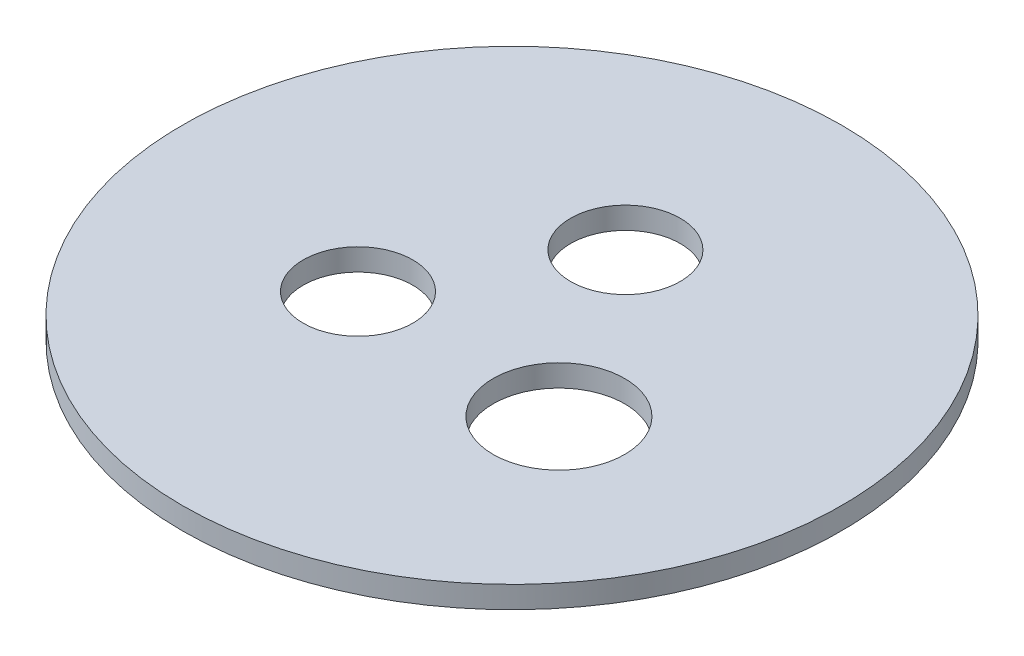
ISO-10303-21;
HEADER;
FILE_DESCRIPTION(('STEP AP214'),'2;1');
FILE_NAME('part.step','',(''),(''),'','','');
FILE_SCHEMA(('AUTOMOTIVE_DESIGN { 1 0 10303 214 1 1 1 1 }'));
ENDSEC;
DATA;
#1=APPLICATION_CONTEXT('core data for automotive mechanical design processes');
#2=APPLICATION_PROTOCOL_DEFINITION('international standard','automotive_design',2000,#1);
#3=PRODUCT_CONTEXT('',#1,'mechanical');
#4=PRODUCT('Part','Part','',(#3));
#5=PRODUCT_RELATED_PRODUCT_CATEGORY('part','',(#4));
#6=PRODUCT_DEFINITION_FORMATION('','',#4);
#7=PRODUCT_DEFINITION_CONTEXT('part definition',#1,'design');
#8=PRODUCT_DEFINITION('design','',#6,#7);
#9=PRODUCT_DEFINITION_SHAPE('','',#8);
#10=(LENGTH_UNIT() NAMED_UNIT(*) SI_UNIT(.MILLI.,.METRE.));
#11=(NAMED_UNIT(*) PLANE_ANGLE_UNIT() SI_UNIT($,.RADIAN.));
#12=(NAMED_UNIT(*) SI_UNIT($,.STERADIAN.) SOLID_ANGLE_UNIT());
#13=UNCERTAINTY_MEASURE_WITH_UNIT(LENGTH_MEASURE(1.E-05),#10,'distance_accuracy_value','');
#14=(GEOMETRIC_REPRESENTATION_CONTEXT(3) GLOBAL_UNCERTAINTY_ASSIGNED_CONTEXT((#13)) GLOBAL_UNIT_ASSIGNED_CONTEXT((#10,
#11,#12)) REPRESENTATION_CONTEXT('',''));
#15=CARTESIAN_POINT('',(0.,0.,0.));
#16=DIRECTION('',(0.,0.,1.));
#17=DIRECTION('',(1.,0.,0.));
#18=AXIS2_PLACEMENT_3D('',#15,#16,#17);
#19=CARTESIAN_POINT('',(0.,2.,0.));
#20=DIRECTION('',(0.,-1.,0.));
#21=DIRECTION('',(0.,0.,-1.));
#22=AXIS2_PLACEMENT_3D('',#19,#20,#21);
#23=CYLINDRICAL_SURFACE('',#22,30.05);
#24=CARTESIAN_POINT('',(0.,2.,0.));
#25=DIRECTION('',(0.,1.,0.));
#26=DIRECTION('',(0.,0.,1.));
#27=AXIS2_PLACEMENT_3D('',#24,#25,#26);
#28=CIRCLE('',#27,30.05);
#29=CARTESIAN_POINT('',(0.,2.,30.05));
#30=VERTEX_POINT('',#29);
#31=EDGE_CURVE('E10',#30,#30,#28,.T.);
#32=ORIENTED_EDGE('',*,*,#31,.F.);
#33=EDGE_LOOP('',(#32));
#34=FACE_BOUND('',#33,.T.);
#35=CARTESIAN_POINT('',(0.,0.,0.));
#36=DIRECTION('',(0.,1.,0.));
#37=DIRECTION('',(0.,0.,1.));
#38=AXIS2_PLACEMENT_3D('',#35,#36,#37);
#39=CIRCLE('',#38,30.05);
#40=CARTESIAN_POINT('',(0.,0.,30.05));
#41=VERTEX_POINT('',#40);
#42=EDGE_CURVE('E34',#41,#41,#39,.T.);
#43=ORIENTED_EDGE('',*,*,#42,.T.);
#44=EDGE_LOOP('',(#43));
#45=FACE_BOUND('',#44,.T.);
#46=ADVANCED_FACE('F31',(#34,#45),#23,.T.);
#47=CARTESIAN_POINT('',(0.,2.,0.));
#48=DIRECTION('',(0.,1.,0.));
#49=DIRECTION('',(0.,0.,1.));
#50=AXIS2_PLACEMENT_3D('',#47,#48,#49);
#51=PLANE('',#50);
#52=CARTESIAN_POINT('',(0.,2.,-10.3418538901785));
#53=DIRECTION('',(0.,1.,0.));
#54=DIRECTION('',(0.,0.,1.));
#55=AXIS2_PLACEMENT_3D('',#52,#53,#54);
#56=CIRCLE('',#55,5.);
#57=CARTESIAN_POINT('',(0.,2.,-5.34185389017855));
#58=VERTEX_POINT('',#57);
#59=EDGE_CURVE('E55',#58,#58,#56,.T.);
#60=ORIENTED_EDGE('',*,*,#59,.F.);
#61=EDGE_LOOP('',(#60));
#62=FACE_BOUND('',#61,.T.);
#63=CARTESIAN_POINT('',(-8.9026543915802,2.,5.13994990948109));
#64=DIRECTION('',(0.,1.,0.));
#65=DIRECTION('',(0.,0.,1.));
#66=AXIS2_PLACEMENT_3D('',#63,#64,#65);
#67=CIRCLE('',#66,5.00000000000001);
#68=CARTESIAN_POINT('',(-8.9026543915802,2.,10.1399499094811));
#69=VERTEX_POINT('',#68);
#70=EDGE_CURVE('E49',#69,#69,#67,.T.);
#71=ORIENTED_EDGE('',*,*,#70,.F.);
#72=EDGE_LOOP('',(#71));
#73=FACE_BOUND('',#72,.T.);
#74=CARTESIAN_POINT('',(10.1251210998582,2.,5.84574139258078));
#75=DIRECTION('',(0.,1.,0.));
#76=DIRECTION('',(0.,0.,1.));
#77=AXIS2_PLACEMENT_3D('',#74,#75,#76);
#78=CIRCLE('',#77,6.);
#79=CARTESIAN_POINT('',(10.1251210998582,2.,11.8457413925808));
#80=VERTEX_POINT('',#79);
#81=EDGE_CURVE('E43',#80,#80,#78,.T.);
#82=ORIENTED_EDGE('',*,*,#81,.F.);
#83=EDGE_LOOP('',(#82));
#84=FACE_BOUND('',#83,.T.);
#85=ORIENTED_EDGE('',*,*,#31,.T.);
#86=EDGE_LOOP('',(#85));
#87=FACE_BOUND('',#86,.T.);
#88=ADVANCED_FACE('F71',(#62,#73,#84,#87),#51,.T.);
#89=CARTESIAN_POINT('',(0.,0.,0.));
#90=DIRECTION('',(0.,1.,0.));
#91=DIRECTION('',(0.,0.,1.));
#92=AXIS2_PLACEMENT_3D('',#89,#90,#91);
#93=PLANE('',#92);
#94=CARTESIAN_POINT('',(0.,0.,-10.3418538901785));
#95=DIRECTION('',(0.,1.,0.));
#96=DIRECTION('',(0.,0.,1.));
#97=AXIS2_PLACEMENT_3D('',#94,#95,#96);
#98=CIRCLE('',#97,5.);
#99=CARTESIAN_POINT('',(0.,0.,-5.34185389017855));
#100=VERTEX_POINT('',#99);
#101=EDGE_CURVE('E41',#100,#100,#98,.T.);
#102=ORIENTED_EDGE('',*,*,#101,.T.);
#103=EDGE_LOOP('',(#102));
#104=FACE_BOUND('',#103,.T.);
#105=CARTESIAN_POINT('',(-8.9026543915802,0.,5.13994990948109));
#106=DIRECTION('',(0.,1.,0.));
#107=DIRECTION('',(0.,0.,1.));
#108=AXIS2_PLACEMENT_3D('',#105,#106,#107);
#109=CIRCLE('',#108,5.00000000000001);
#110=CARTESIAN_POINT('',(-8.9026543915802,0.,10.1399499094811));
#111=VERTEX_POINT('',#110);
#112=EDGE_CURVE('E52',#111,#111,#109,.T.);
#113=ORIENTED_EDGE('',*,*,#112,.T.);
#114=EDGE_LOOP('',(#113));
#115=FACE_BOUND('',#114,.T.);
#116=CARTESIAN_POINT('',(10.1251210998582,0.,5.84574139258078));
#117=DIRECTION('',(0.,1.,0.));
#118=DIRECTION('',(0.,0.,1.));
#119=AXIS2_PLACEMENT_3D('',#116,#117,#118);
#120=CIRCLE('',#119,6.);
#121=CARTESIAN_POINT('',(10.1251210998582,0.,11.8457413925808));
#122=VERTEX_POINT('',#121);
#123=EDGE_CURVE('E46',#122,#122,#120,.T.);
#124=ORIENTED_EDGE('',*,*,#123,.T.);
#125=EDGE_LOOP('',(#124));
#126=FACE_BOUND('',#125,.T.);
#127=ORIENTED_EDGE('',*,*,#42,.F.);
#128=EDGE_LOOP('',(#127));
#129=FACE_BOUND('',#128,.T.);
#130=ADVANCED_FACE('F61',(#104,#115,#126,#129),#93,.F.);
#131=CARTESIAN_POINT('',(10.1251210998582,0.,5.84574139258078));
#132=DIRECTION('',(0.,1.,0.));
#133=DIRECTION('',(0.,0.,1.));
#134=AXIS2_PLACEMENT_3D('',#131,#132,#133);
#135=CYLINDRICAL_SURFACE('',#134,6.);
#136=ORIENTED_EDGE('',*,*,#123,.F.);
#137=EDGE_LOOP('',(#136));
#138=FACE_BOUND('',#137,.T.);
#139=ORIENTED_EDGE('',*,*,#81,.T.);
#140=EDGE_LOOP('',(#139));
#141=FACE_BOUND('',#140,.T.);
#142=ADVANCED_FACE('F79',(#138,#141),#135,.F.);
#143=CARTESIAN_POINT('',(-8.9026543915802,0.,5.13994990948109));
#144=DIRECTION('',(0.,1.,0.));
#145=DIRECTION('',(0.,0.,1.));
#146=AXIS2_PLACEMENT_3D('',#143,#144,#145);
#147=CYLINDRICAL_SURFACE('',#146,5.00000000000001);
#148=ORIENTED_EDGE('',*,*,#112,.F.);
#149=EDGE_LOOP('',(#148));
#150=FACE_BOUND('',#149,.T.);
#151=ORIENTED_EDGE('',*,*,#70,.T.);
#152=EDGE_LOOP('',(#151));
#153=FACE_BOUND('',#152,.T.);
#154=ADVANCED_FACE('F67',(#150,#153),#147,.F.);
#155=CARTESIAN_POINT('',(0.,0.,-10.3418538901785));
#156=DIRECTION('',(0.,1.,0.));
#157=DIRECTION('',(0.,0.,1.));
#158=AXIS2_PLACEMENT_3D('',#155,#156,#157);
#159=CYLINDRICAL_SURFACE('',#158,5.);
#160=ORIENTED_EDGE('',*,*,#101,.F.);
#161=EDGE_LOOP('',(#160));
#162=FACE_BOUND('',#161,.T.);
#163=ORIENTED_EDGE('',*,*,#59,.T.);
#164=EDGE_LOOP('',(#163));
#165=FACE_BOUND('',#164,.T.);
#166=ADVANCED_FACE('F64',(#162,#165),#159,.F.);
#167=CLOSED_SHELL('',(#46,#88,#130,#142,#154,#166));
#168=MANIFOLD_SOLID_BREP('B2',#167);
#169=ADVANCED_BREP_SHAPE_REPRESENTATION('',(#18,#168),#14);
#170=SHAPE_DEFINITION_REPRESENTATION(#9,#169);
ENDSEC;
END-ISO-10303-21;
